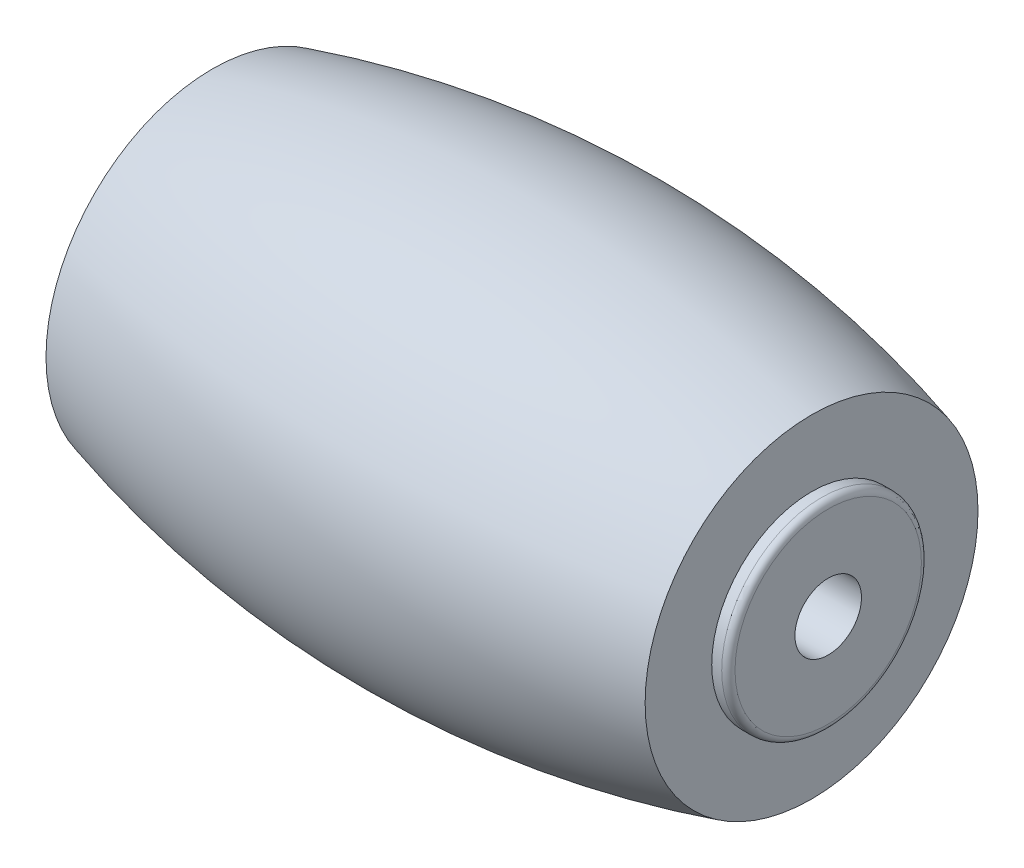
ISO-10303-21;
HEADER;
FILE_DESCRIPTION(('STEP AP214'),'2;1');
FILE_NAME('part.step','',(''),(''),'','','');
FILE_SCHEMA(('AUTOMOTIVE_DESIGN { 1 0 10303 214 1 1 1 1 }'));
ENDSEC;
DATA;
#1=APPLICATION_CONTEXT('core data for automotive mechanical design processes');
#2=APPLICATION_PROTOCOL_DEFINITION('international standard','automotive_design',2000,#1);
#3=PRODUCT_CONTEXT('',#1,'mechanical');
#4=PRODUCT('Part','Part','',(#3));
#5=PRODUCT_RELATED_PRODUCT_CATEGORY('part','',(#4));
#6=PRODUCT_DEFINITION_FORMATION('','',#4);
#7=PRODUCT_DEFINITION_CONTEXT('part definition',#1,'design');
#8=PRODUCT_DEFINITION('design','',#6,#7);
#9=PRODUCT_DEFINITION_SHAPE('','',#8);
#10=(LENGTH_UNIT() NAMED_UNIT(*) SI_UNIT(.MILLI.,.METRE.));
#11=(NAMED_UNIT(*) PLANE_ANGLE_UNIT() SI_UNIT($,.RADIAN.));
#12=(NAMED_UNIT(*) SI_UNIT($,.STERADIAN.) SOLID_ANGLE_UNIT());
#13=UNCERTAINTY_MEASURE_WITH_UNIT(LENGTH_MEASURE(1.E-05),#10,'distance_accuracy_value','');
#14=(GEOMETRIC_REPRESENTATION_CONTEXT(3) GLOBAL_UNCERTAINTY_ASSIGNED_CONTEXT((#13)) GLOBAL_UNIT_ASSIGNED_CONTEXT((#10,
#11,#12)) REPRESENTATION_CONTEXT('',''));
#15=CARTESIAN_POINT('',(0.,0.,0.));
#16=DIRECTION('',(0.,0.,1.));
#17=DIRECTION('',(1.,0.,0.));
#18=AXIS2_PLACEMENT_3D('',#15,#16,#17);
#19=CARTESIAN_POINT('',(8.99999999999999,0.,0.));
#20=DIRECTION('',(1.,0.,0.));
#21=DIRECTION('',(0.,0.,-1.));
#22=AXIS2_PLACEMENT_3D('',#19,#20,#21);
#23=PLANE('',#22);
#24=CARTESIAN_POINT('',(8.99999999999999,0.,0.));
#25=DIRECTION('',(1.,0.,0.));
#26=DIRECTION('',(0.,0.,-1.));
#27=AXIS2_PLACEMENT_3D('',#24,#25,#26);
#28=CIRCLE('',#27,3.);
#29=CARTESIAN_POINT('',(8.99999999999999,0.,-3.));
#30=VERTEX_POINT('',#29);
#31=EDGE_CURVE('E50',#30,#30,#28,.T.);
#32=ORIENTED_EDGE('',*,*,#31,.F.);
#33=EDGE_LOOP('',(#32));
#34=FACE_BOUND('',#33,.T.);
#35=CARTESIAN_POINT('',(8.99999999999998,0.,0.));
#36=DIRECTION('',(1.,0.,0.));
#37=DIRECTION('',(0.,0.,-1.));
#38=AXIS2_PLACEMENT_3D('',#35,#36,#37);
#39=CIRCLE('',#38,5.);
#40=CARTESIAN_POINT('',(8.99999999999998,0.,-5.));
#41=VERTEX_POINT('',#40);
#42=EDGE_CURVE('E54',#41,#41,#39,.T.);
#43=ORIENTED_EDGE('',*,*,#42,.T.);
#44=EDGE_LOOP('',(#43));
#45=FACE_BOUND('',#44,.T.);
#46=ADVANCED_FACE('F30',(#34,#45),#23,.T.);
#47=CARTESIAN_POINT('',(-9.,0.,0.));
#48=DIRECTION('',(-1.,0.,0.));
#49=DIRECTION('',(0.,0.,1.));
#50=AXIS2_PLACEMENT_3D('',#47,#48,#49);
#51=PLANE('',#50);
#52=CARTESIAN_POINT('',(-8.99999999999999,0.,0.));
#53=DIRECTION('',(1.,0.,0.));
#54=DIRECTION('',(0.,0.,-1.));
#55=AXIS2_PLACEMENT_3D('',#52,#53,#54);
#56=CIRCLE('',#55,3.);
#57=CARTESIAN_POINT('',(-8.99999999999999,0.,-3.));
#58=VERTEX_POINT('',#57);
#59=EDGE_CURVE('E57',#58,#58,#56,.T.);
#60=ORIENTED_EDGE('',*,*,#59,.T.);
#61=EDGE_LOOP('',(#60));
#62=FACE_BOUND('',#61,.T.);
#63=CARTESIAN_POINT('',(-9.,0.,0.));
#64=DIRECTION('',(1.,0.,0.));
#65=DIRECTION('',(0.,0.,-1.));
#66=AXIS2_PLACEMENT_3D('',#63,#64,#65);
#67=CIRCLE('',#66,5.);
#68=CARTESIAN_POINT('',(-9.,0.,-5.));
#69=VERTEX_POINT('',#68);
#70=EDGE_CURVE('E51',#69,#69,#67,.T.);
#71=ORIENTED_EDGE('',*,*,#70,.F.);
#72=EDGE_LOOP('',(#71));
#73=FACE_BOUND('',#72,.T.);
#74=ADVANCED_FACE('F87',(#62,#73),#51,.T.);
#75=CARTESIAN_POINT('',(0.,0.,0.));
#76=DIRECTION('',(1.,0.,0.));
#77=DIRECTION('',(0.,0.,-1.));
#78=AXIS2_PLACEMENT_3D('',#75,#76,#77);
#79=DEGENERATE_TOROIDAL_SURFACE('',#78,26.7836447571631,33.0333176361313,.F.);
#80=ORIENTED_EDGE('',*,*,#70,.T.);
#81=EDGE_LOOP('',(#80));
#82=FACE_BOUND('',#81,.T.);
#83=ORIENTED_EDGE('',*,*,#42,.F.);
#84=EDGE_LOOP('',(#83));
#85=FACE_BOUND('',#84,.T.);
#86=ADVANCED_FACE('F93',(#82,#85),#79,.F.);
#87=CARTESIAN_POINT('',(9.49999999999999,0.,0.));
#88=DIRECTION('',(-1.,0.,0.));
#89=DIRECTION('',(0.,0.,1.));
#90=AXIS2_PLACEMENT_3D('',#87,#88,#89);
#91=CYLINDRICAL_SURFACE('',#90,3.);
#92=CARTESIAN_POINT('',(9.29999999999999,0.,0.));
#93=DIRECTION('',(1.,0.,0.));
#94=DIRECTION('',(0.,0.,-1.));
#95=AXIS2_PLACEMENT_3D('',#92,#93,#94);
#96=CIRCLE('',#95,3.);
#97=CARTESIAN_POINT('',(9.29999999999999,0.,-3.));
#98=VERTEX_POINT('',#97);
#99=EDGE_CURVE('E41',#98,#98,#96,.F.);
#100=ORIENTED_EDGE('',*,*,#99,.T.);
#101=EDGE_LOOP('',(#100));
#102=FACE_BOUND('',#101,.T.);
#103=ORIENTED_EDGE('',*,*,#31,.T.);
#104=EDGE_LOOP('',(#103));
#105=FACE_BOUND('',#104,.T.);
#106=ADVANCED_FACE('F110',(#102,#105),#91,.T.);
#107=CARTESIAN_POINT('',(9.49999999999999,0.,0.));
#108=DIRECTION('',(1.,0.,0.));
#109=DIRECTION('',(0.,0.,-1.));
#110=AXIS2_PLACEMENT_3D('',#107,#108,#109);
#111=PLANE('',#110);
#112=CARTESIAN_POINT('',(9.49999999999999,0.,0.));
#113=DIRECTION('',(1.,0.,0.));
#114=DIRECTION('',(0.,0.,-1.));
#115=AXIS2_PLACEMENT_3D('',#112,#113,#114);
#116=CIRCLE('',#115,2.8);
#117=CARTESIAN_POINT('',(9.49999999999999,0.,-2.8));
#118=VERTEX_POINT('',#117);
#119=EDGE_CURVE('E45',#118,#118,#116,.T.);
#120=ORIENTED_EDGE('',*,*,#119,.T.);
#121=EDGE_LOOP('',(#120));
#122=FACE_BOUND('',#121,.T.);
#123=CARTESIAN_POINT('',(9.49999999999999,0.,0.));
#124=DIRECTION('',(-1.,0.,0.));
#125=DIRECTION('',(0.,0.,1.));
#126=AXIS2_PLACEMENT_3D('',#123,#124,#125);
#127=CIRCLE('',#126,1.);
#128=CARTESIAN_POINT('',(9.49999999999999,0.,1.));
#129=VERTEX_POINT('',#128);
#130=EDGE_CURVE('E62',#129,#129,#127,.T.);
#131=ORIENTED_EDGE('',*,*,#130,.T.);
#132=EDGE_LOOP('',(#131));
#133=FACE_BOUND('',#132,.T.);
#134=ADVANCED_FACE('F69',(#122,#133),#111,.T.);
#135=CARTESIAN_POINT('',(-9.49999999999999,0.,0.));
#136=DIRECTION('',(1.,0.,0.));
#137=DIRECTION('',(0.,0.,-1.));
#138=AXIS2_PLACEMENT_3D('',#135,#136,#137);
#139=CYLINDRICAL_SURFACE('',#138,3.);
#140=CARTESIAN_POINT('',(-9.29999999999999,0.,0.));
#141=DIRECTION('',(-1.,0.,0.));
#142=DIRECTION('',(0.,0.,1.));
#143=AXIS2_PLACEMENT_3D('',#140,#141,#142);
#144=CIRCLE('',#143,3.);
#145=CARTESIAN_POINT('',(-9.29999999999999,0.,3.));
#146=VERTEX_POINT('',#145);
#147=EDGE_CURVE('E37',#146,#146,#144,.F.);
#148=ORIENTED_EDGE('',*,*,#147,.T.);
#149=EDGE_LOOP('',(#148));
#150=FACE_BOUND('',#149,.T.);
#151=ORIENTED_EDGE('',*,*,#59,.F.);
#152=EDGE_LOOP('',(#151));
#153=FACE_BOUND('',#152,.T.);
#154=ADVANCED_FACE('F80',(#150,#153),#139,.T.);
#155=CARTESIAN_POINT('',(-9.49999999999999,0.,0.));
#156=DIRECTION('',(-1.,0.,0.));
#157=DIRECTION('',(0.,0.,-1.));
#158=AXIS2_PLACEMENT_3D('',#155,#156,#157);
#159=PLANE('',#158);
#160=CARTESIAN_POINT('',(-9.49999999999999,0.,0.));
#161=DIRECTION('',(-1.,0.,0.));
#162=DIRECTION('',(0.,0.,1.));
#163=AXIS2_PLACEMENT_3D('',#160,#161,#162);
#164=CIRCLE('',#163,2.8);
#165=CARTESIAN_POINT('',(-9.49999999999999,0.,2.8));
#166=VERTEX_POINT('',#165);
#167=EDGE_CURVE('E10',#166,#166,#164,.T.);
#168=ORIENTED_EDGE('',*,*,#167,.T.);
#169=EDGE_LOOP('',(#168));
#170=FACE_BOUND('',#169,.T.);
#171=CARTESIAN_POINT('',(-9.49999999999999,0.,0.));
#172=DIRECTION('',(-1.,0.,0.));
#173=DIRECTION('',(0.,0.,1.));
#174=AXIS2_PLACEMENT_3D('',#171,#172,#173);
#175=CIRCLE('',#174,1.);
#176=CARTESIAN_POINT('',(-9.49999999999999,0.,1.));
#177=VERTEX_POINT('',#176);
#178=EDGE_CURVE('E63',#177,#177,#175,.T.);
#179=ORIENTED_EDGE('',*,*,#178,.F.);
#180=EDGE_LOOP('',(#179));
#181=FACE_BOUND('',#180,.T.);
#182=ADVANCED_FACE('F75',(#170,#181),#159,.T.);
#183=CARTESIAN_POINT('',(9.49999999999999,0.,0.));
#184=DIRECTION('',(-1.,0.,0.));
#185=DIRECTION('',(0.,0.,1.));
#186=AXIS2_PLACEMENT_3D('',#183,#184,#185);
#187=CYLINDRICAL_SURFACE('',#186,1.);
#188=CARTESIAN_POINT('',(9.49999999999999,0.,1.));
#189=CARTESIAN_POINT('',(9.30208333333333,0.,1.));
#190=CARTESIAN_POINT('',(9.10416666666666,0.,1.));
#191=CARTESIAN_POINT('',(8.70833333333333,0.,1.));
#192=CARTESIAN_POINT('',(8.51041666666666,0.,1.));
#193=CARTESIAN_POINT('',(8.11458333333333,0.,1.));
#194=CARTESIAN_POINT('',(7.91666666666666,0.,1.));
#195=CARTESIAN_POINT('',(7.52083333333333,0.,1.));
#196=CARTESIAN_POINT('',(7.32291666666666,0.,1.));
#197=CARTESIAN_POINT('',(6.92708333333333,0.,1.));
#198=CARTESIAN_POINT('',(6.72916666666666,0.,1.));
#199=CARTESIAN_POINT('',(6.33333333333333,0.,1.));
#200=CARTESIAN_POINT('',(6.13541666666666,0.,1.));
#201=CARTESIAN_POINT('',(5.73958333333333,0.,1.));
#202=CARTESIAN_POINT('',(5.54166666666666,0.,1.));
#203=CARTESIAN_POINT('',(5.14583333333333,0.,1.));
#204=CARTESIAN_POINT('',(4.94791666666666,0.,1.));
#205=CARTESIAN_POINT('',(4.55208333333333,0.,1.));
#206=CARTESIAN_POINT('',(4.35416666666666,0.,1.));
#207=CARTESIAN_POINT('',(3.95833333333333,0.,1.));
#208=CARTESIAN_POINT('',(3.76041666666666,0.,1.));
#209=CARTESIAN_POINT('',(3.36458333333333,0.,1.));
#210=CARTESIAN_POINT('',(3.16666666666667,0.,1.));
#211=CARTESIAN_POINT('',(2.77083333333333,0.,1.));
#212=CARTESIAN_POINT('',(2.57291666666667,0.,1.));
#213=CARTESIAN_POINT('',(2.17708333333333,0.,1.));
#214=CARTESIAN_POINT('',(1.97916666666667,0.,1.));
#215=CARTESIAN_POINT('',(1.58333333333333,0.,1.));
#216=CARTESIAN_POINT('',(1.38541666666667,0.,1.));
#217=CARTESIAN_POINT('',(0.989583333333334,0.,1.));
#218=CARTESIAN_POINT('',(0.791666666666667,0.,1.));
#219=CARTESIAN_POINT('',(0.395833333333334,0.,1.));
#220=CARTESIAN_POINT('',(0.197916666666668,0.,1.));
#221=CARTESIAN_POINT('',(-0.197916666666665,0.,1.));
#222=CARTESIAN_POINT('',(-0.395833333333331,0.,1.));
#223=CARTESIAN_POINT('',(-0.791666666666664,0.,1.));
#224=CARTESIAN_POINT('',(-0.989583333333331,0.,1.));
#225=CARTESIAN_POINT('',(-1.38541666666666,0.,1.));
#226=CARTESIAN_POINT('',(-1.58333333333333,0.,1.));
#227=CARTESIAN_POINT('',(-1.97916666666666,0.,1.));
#228=CARTESIAN_POINT('',(-2.17708333333333,0.,1.));
#229=CARTESIAN_POINT('',(-2.57291666666666,0.,1.));
#230=CARTESIAN_POINT('',(-2.77083333333333,0.,1.));
#231=CARTESIAN_POINT('',(-3.16666666666666,0.,1.));
#232=CARTESIAN_POINT('',(-3.36458333333333,0.,1.));
#233=CARTESIAN_POINT('',(-3.76041666666666,0.,1.));
#234=CARTESIAN_POINT('',(-3.95833333333333,0.,1.));
#235=CARTESIAN_POINT('',(-4.35416666666666,0.,1.));
#236=CARTESIAN_POINT('',(-4.55208333333333,0.,1.));
#237=CARTESIAN_POINT('',(-4.94791666666666,0.,1.));
#238=CARTESIAN_POINT('',(-5.14583333333333,0.,1.));
#239=CARTESIAN_POINT('',(-5.54166666666666,0.,1.));
#240=CARTESIAN_POINT('',(-5.73958333333333,0.,1.));
#241=CARTESIAN_POINT('',(-6.13541666666666,0.,1.));
#242=CARTESIAN_POINT('',(-6.33333333333333,0.,1.));
#243=CARTESIAN_POINT('',(-6.72916666666666,0.,1.));
#244=CARTESIAN_POINT('',(-6.92708333333332,0.,1.));
#245=CARTESIAN_POINT('',(-7.32291666666666,0.,1.));
#246=CARTESIAN_POINT('',(-7.52083333333332,0.,1.));
#247=CARTESIAN_POINT('',(-7.91666666666666,0.,1.));
#248=CARTESIAN_POINT('',(-8.11458333333332,0.,1.));
#249=CARTESIAN_POINT('',(-8.51041666666666,0.,1.));
#250=CARTESIAN_POINT('',(-8.70833333333332,0.,1.));
#251=CARTESIAN_POINT('',(-9.10416666666665,0.,1.));
#252=CARTESIAN_POINT('',(-9.30208333333332,0.,1.));
#253=CARTESIAN_POINT('',(-9.49999999999999,0.,1.));
#254=B_SPLINE_CURVE_WITH_KNOTS('',3,(#188,#189,#190,#191,#192,#193,#194,#195,#196,#197,#198,
#199,#200,#201,#202,#203,#204,#205,#206,#207,#208,#209,#210,#211,#212,#213,#214,#215,#216,#217,
#218,#219,#220,#221,#222,#223,#224,#225,#226,#227,#228,#229,#230,#231,#232,#233,#234,#235,#236,
#237,#238,#239,#240,#241,#242,#243,#244,#245,#246,#247,#248,#249,#250,#251,#252,#253),
.UNSPECIFIED.,.F.,.F.,(4,2,2,2,2,2,2,2,2,2,2,2,2,2,2,2,2,2,2,2,2,2,2,2,2,2,2,2,2,2,2,2,4),(0.,
0.593749999999999,1.1875,1.78125,2.375,2.96875,3.5625,4.15624999999999,4.74999999999999,
5.34374999999999,5.93749999999999,6.53124999999999,7.12499999999999,7.71874999999999,
8.31249999999999,8.90624999999999,9.49999999999999,10.09375,10.6875,11.28125,11.875,12.46875,
13.0625,13.65625,14.25,14.84375,15.4375,16.03125,16.625,17.21875,17.8125,18.40625,19.),.UNSPECIFIED.);
#255=EDGE_CURVE('BSEAM71',#129,#177,#254,.T.);
#256=ORIENTED_EDGE('',*,*,#130,.F.);
#257=ORIENTED_EDGE('',*,*,#178,.T.);
#258=ORIENTED_EDGE('',*,*,#255,.T.);
#259=ORIENTED_EDGE('',*,*,#255,.F.);
#260=EDGE_LOOP('',(#256,#258,#257,#259));
#261=FACE_BOUND('',#260,.T.);
#262=ADVANCED_FACE('F71',(#261),#187,.F.);
#263=CARTESIAN_POINT('',(9.29999999999999,0.,0.));
#264=DIRECTION('',(1.,0.,0.));
#265=DIRECTION('',(0.,0.,-1.));
#266=AXIS2_PLACEMENT_3D('',#263,#264,#265);
#267=TOROIDAL_SURFACE('',#266,2.8,0.2);
#268=ORIENTED_EDGE('',*,*,#99,.F.);
#269=EDGE_LOOP('',(#268));
#270=FACE_BOUND('',#269,.T.);
#271=ORIENTED_EDGE('',*,*,#119,.F.);
#272=EDGE_LOOP('',(#271));
#273=FACE_BOUND('',#272,.T.);
#274=ADVANCED_FACE('F74',(#270,#273),#267,.T.);
#275=CARTESIAN_POINT('',(-9.29999999999999,0.,0.));
#276=DIRECTION('',(-1.,0.,0.));
#277=DIRECTION('',(0.,0.,1.));
#278=AXIS2_PLACEMENT_3D('',#275,#276,#277);
#279=TOROIDAL_SURFACE('',#278,2.8,0.2);
#280=ORIENTED_EDGE('',*,*,#167,.F.);
#281=EDGE_LOOP('',(#280));
#282=FACE_BOUND('',#281,.T.);
#283=ORIENTED_EDGE('',*,*,#147,.F.);
#284=EDGE_LOOP('',(#283));
#285=FACE_BOUND('',#284,.T.);
#286=ADVANCED_FACE('F32',(#282,#285),#279,.T.);
#287=CLOSED_SHELL('',(#46,#74,#86,#106,#134,#154,#182,#262,#274,#286));
#288=MANIFOLD_SOLID_BREP('B2',#287);
#289=ADVANCED_BREP_SHAPE_REPRESENTATION('',(#18,#288),#14);
#290=SHAPE_DEFINITION_REPRESENTATION(#9,#289);
ENDSEC;
END-ISO-10303-21;
